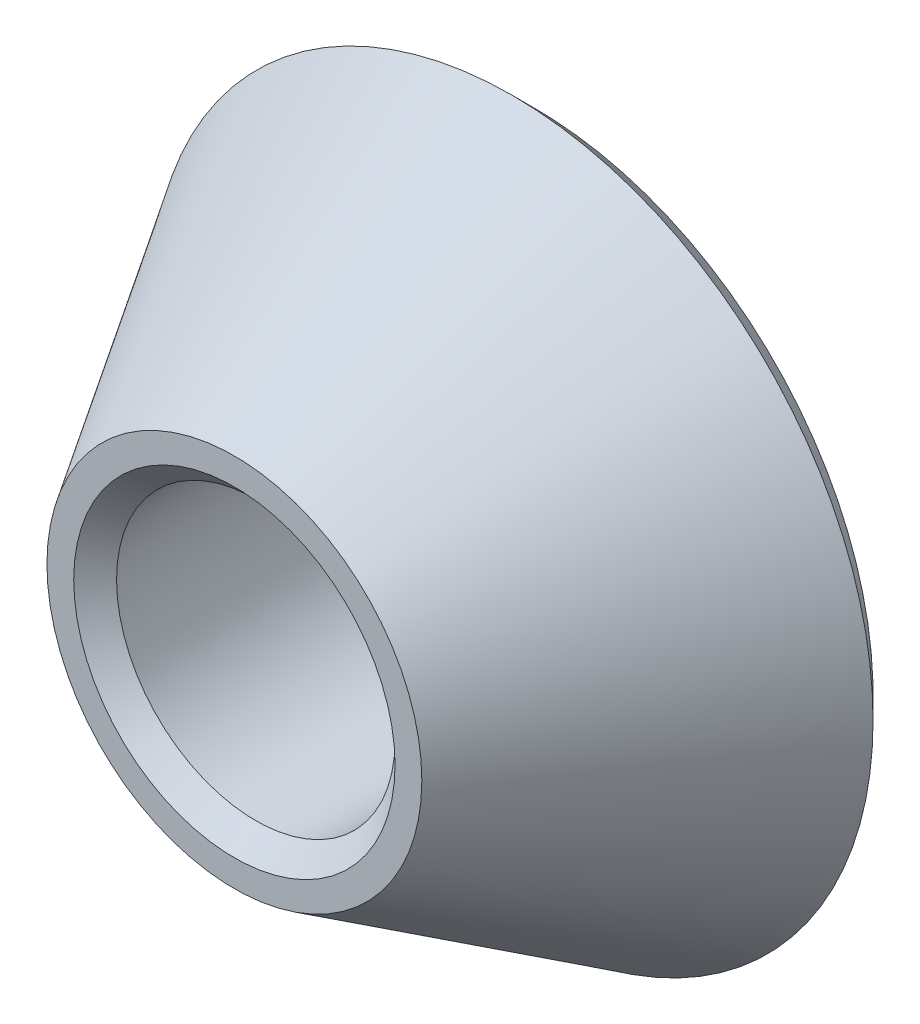
ISO-10303-21;
HEADER;
FILE_DESCRIPTION(('STEP AP214'),'2;1');
FILE_NAME('part.step','',(''),(''),'','','');
FILE_SCHEMA(('AUTOMOTIVE_DESIGN { 1 0 10303 214 1 1 1 1 }'));
ENDSEC;
DATA;
#1=APPLICATION_CONTEXT('core data for automotive mechanical design processes');
#2=APPLICATION_PROTOCOL_DEFINITION('international standard','automotive_design',2000,#1);
#3=PRODUCT_CONTEXT('',#1,'mechanical');
#4=PRODUCT('Part','Part','',(#3));
#5=PRODUCT_RELATED_PRODUCT_CATEGORY('part','',(#4));
#6=PRODUCT_DEFINITION_FORMATION('','',#4);
#7=PRODUCT_DEFINITION_CONTEXT('part definition',#1,'design');
#8=PRODUCT_DEFINITION('design','',#6,#7);
#9=PRODUCT_DEFINITION_SHAPE('','',#8);
#10=(LENGTH_UNIT() NAMED_UNIT(*) SI_UNIT(.MILLI.,.METRE.));
#11=(NAMED_UNIT(*) PLANE_ANGLE_UNIT() SI_UNIT($,.RADIAN.));
#12=(NAMED_UNIT(*) SI_UNIT($,.STERADIAN.) SOLID_ANGLE_UNIT());
#13=UNCERTAINTY_MEASURE_WITH_UNIT(LENGTH_MEASURE(1.E-05),#10,'distance_accuracy_value','');
#14=(GEOMETRIC_REPRESENTATION_CONTEXT(3) GLOBAL_UNCERTAINTY_ASSIGNED_CONTEXT((#13)) GLOBAL_UNIT_ASSIGNED_CONTEXT((#10,
#11,#12)) REPRESENTATION_CONTEXT('',''));
#15=CARTESIAN_POINT('',(0.,0.,0.));
#16=DIRECTION('',(0.,0.,1.));
#17=DIRECTION('',(1.,0.,0.));
#18=AXIS2_PLACEMENT_3D('',#15,#16,#17);
#19=CARTESIAN_POINT('',(0.,6.32554230522413,0.));
#20=DIRECTION('',(0.,0.,-1.));
#21=DIRECTION('',(-1.,0.,0.));
#22=AXIS2_PLACEMENT_3D('',#19,#20,#21);
#23=PLANE('',#22);
#24=CARTESIAN_POINT('',(0.,0.,0.));
#25=DIRECTION('',(0.,0.,-1.));
#26=DIRECTION('',(-1.,0.,0.));
#27=AXIS2_PLACEMENT_3D('',#24,#25,#26);
#28=CIRCLE('',#27,3.00000000000001);
#29=CARTESIAN_POINT('',(-3.00000000000001,0.,0.));
#30=VERTEX_POINT('',#29);
#31=EDGE_CURVE('E10',#30,#30,#28,.F.);
#32=ORIENTED_EDGE('',*,*,#31,.T.);
#33=EDGE_LOOP('',(#32));
#34=FACE_BOUND('',#33,.T.);
#35=CARTESIAN_POINT('',(0.,0.,0.));
#36=DIRECTION('',(0.,0.,-1.));
#37=DIRECTION('',(-1.,0.,0.));
#38=AXIS2_PLACEMENT_3D('',#35,#36,#37);
#39=CIRCLE('',#38,6.32554230522413);
#40=CARTESIAN_POINT('',(-6.32554230522413,0.,0.));
#41=VERTEX_POINT('',#40);
#42=EDGE_CURVE('E61',#41,#41,#39,.T.);
#43=ORIENTED_EDGE('',*,*,#42,.T.);
#44=EDGE_LOOP('',(#43));
#45=FACE_BOUND('',#44,.T.);
#46=ADVANCED_FACE('F34',(#34,#45),#23,.T.);
#47=CARTESIAN_POINT('',(0.,0.,0.));
#48=DIRECTION('',(0.,0.,-1.));
#49=DIRECTION('',(-1.,0.,0.));
#50=AXIS2_PLACEMENT_3D('',#47,#48,#49);
#51=CYLINDRICAL_SURFACE('',#50,2.6);
#52=CARTESIAN_POINT('',(0.,0.,5.2));
#53=DIRECTION('',(0.,0.,1.));
#54=DIRECTION('',(1.,0.,0.));
#55=AXIS2_PLACEMENT_3D('',#52,#53,#54);
#56=CIRCLE('',#55,2.6);
#57=CARTESIAN_POINT('',(2.6,0.,5.2));
#58=VERTEX_POINT('',#57);
#59=EDGE_CURVE('E42',#58,#58,#56,.T.);
#60=ORIENTED_EDGE('',*,*,#59,.T.);
#61=EDGE_LOOP('',(#60));
#62=FACE_BOUND('',#61,.T.);
#63=CARTESIAN_POINT('',(0.,0.,0.400000000000005));
#64=DIRECTION('',(0.,0.,-1.));
#65=DIRECTION('',(-1.,0.,0.));
#66=AXIS2_PLACEMENT_3D('',#63,#64,#65);
#67=CIRCLE('',#66,2.6);
#68=CARTESIAN_POINT('',(-2.6,0.,0.400000000000005));
#69=VERTEX_POINT('',#68);
#70=EDGE_CURVE('E46',#69,#69,#67,.T.);
#71=ORIENTED_EDGE('',*,*,#70,.T.);
#72=EDGE_LOOP('',(#71));
#73=FACE_BOUND('',#72,.T.);
#74=ADVANCED_FACE('F81',(#62,#73),#51,.F.);
#75=CARTESIAN_POINT('',(0.,2.6,5.6));
#76=DIRECTION('',(0.,0.,1.));
#77=DIRECTION('',(1.,0.,0.));
#78=AXIS2_PLACEMENT_3D('',#75,#76,#77);
#79=PLANE('',#78);
#80=CARTESIAN_POINT('',(0.,0.,5.6));
#81=DIRECTION('',(0.,0.,1.));
#82=DIRECTION('',(1.,0.,0.));
#83=AXIS2_PLACEMENT_3D('',#80,#81,#82);
#84=CIRCLE('',#83,3.);
#85=CARTESIAN_POINT('',(3.,0.,5.6));
#86=VERTEX_POINT('',#85);
#87=EDGE_CURVE('E50',#86,#86,#84,.F.);
#88=ORIENTED_EDGE('',*,*,#87,.T.);
#89=EDGE_LOOP('',(#88));
#90=FACE_BOUND('',#89,.T.);
#91=CARTESIAN_POINT('',(0.,0.,5.6));
#92=DIRECTION('',(0.,0.,-1.));
#93=DIRECTION('',(-1.,0.,0.));
#94=AXIS2_PLACEMENT_3D('',#91,#92,#93);
#95=CIRCLE('',#94,3.5);
#96=CARTESIAN_POINT('',(-3.5,0.,5.6));
#97=VERTEX_POINT('',#96);
#98=EDGE_CURVE('E55',#97,#97,#95,.T.);
#99=ORIENTED_EDGE('',*,*,#98,.F.);
#100=EDGE_LOOP('',(#99));
#101=FACE_BOUND('',#100,.T.);
#102=ADVANCED_FACE('F77',(#90,#101),#79,.T.);
#103=CARTESIAN_POINT('',(0.,0.,0.415050889092845));
#104=DIRECTION('',(0.,0.,-1.));
#105=DIRECTION('',(-1.,0.,0.));
#106=AXIS2_PLACEMENT_3D('',#103,#104,#105);
#107=CONICAL_SURFACE('',#106,6.74059319431697,0.558599315343563);
#108=ORIENTED_EDGE('',*,*,#98,.T.);
#109=EDGE_LOOP('',(#108));
#110=FACE_BOUND('',#109,.T.);
#111=CARTESIAN_POINT('',(0.,0.,0.415050889092845));
#112=DIRECTION('',(0.,0.,-1.));
#113=DIRECTION('',(-1.,0.,0.));
#114=AXIS2_PLACEMENT_3D('',#111,#112,#113);
#115=CIRCLE('',#114,6.74059319431697);
#116=CARTESIAN_POINT('',(-6.74059319431697,0.,0.415050889092845));
#117=VERTEX_POINT('',#116);
#118=EDGE_CURVE('E58',#117,#117,#115,.T.);
#119=ORIENTED_EDGE('',*,*,#118,.F.);
#120=EDGE_LOOP('',(#119));
#121=FACE_BOUND('',#120,.T.);
#122=ADVANCED_FACE('F69',(#110,#121),#107,.T.);
#123=CARTESIAN_POINT('',(0.,0.,0.));
#124=DIRECTION('',(0.,0.,1.));
#125=DIRECTION('',(1.,0.,0.));
#126=AXIS2_PLACEMENT_3D('',#123,#124,#125);
#127=CONICAL_SURFACE('',#126,6.32554230522413,0.78539816339745);
#128=ORIENTED_EDGE('',*,*,#118,.T.);
#129=EDGE_LOOP('',(#128));
#130=FACE_BOUND('',#129,.T.);
#131=ORIENTED_EDGE('',*,*,#42,.F.);
#132=EDGE_LOOP('',(#131));
#133=FACE_BOUND('',#132,.T.);
#134=ADVANCED_FACE('F66',(#130,#133),#127,.T.);
#135=CARTESIAN_POINT('',(0.,0.,5.6));
#136=DIRECTION('',(0.,0.,1.));
#137=DIRECTION('',(1.,0.,0.));
#138=AXIS2_PLACEMENT_3D('',#135,#136,#137);
#139=CONICAL_SURFACE('',#138,3.,0.785398163397448);
#140=ORIENTED_EDGE('',*,*,#59,.F.);
#141=EDGE_LOOP('',(#140));
#142=FACE_BOUND('',#141,.T.);
#143=ORIENTED_EDGE('',*,*,#87,.F.);
#144=EDGE_LOOP('',(#143));
#145=FACE_BOUND('',#144,.T.);
#146=ADVANCED_FACE('F68',(#142,#145),#139,.F.);
#147=CARTESIAN_POINT('',(0.,0.,0.400000000000005));
#148=DIRECTION('',(0.,0.,-1.));
#149=DIRECTION('',(-1.,0.,0.));
#150=AXIS2_PLACEMENT_3D('',#147,#148,#149);
#151=CONICAL_SURFACE('',#150,2.6,0.78539816339745);
#152=ORIENTED_EDGE('',*,*,#31,.F.);
#153=EDGE_LOOP('',(#152));
#154=FACE_BOUND('',#153,.T.);
#155=ORIENTED_EDGE('',*,*,#70,.F.);
#156=EDGE_LOOP('',(#155));
#157=FACE_BOUND('',#156,.T.);
#158=ADVANCED_FACE('F37',(#154,#157),#151,.F.);
#159=CLOSED_SHELL('',(#46,#74,#102,#122,#134,#146,#158));
#160=MANIFOLD_SOLID_BREP('B2',#159);
#161=ADVANCED_BREP_SHAPE_REPRESENTATION('',(#18,#160),#14);
#162=SHAPE_DEFINITION_REPRESENTATION(#9,#161);
ENDSEC;
END-ISO-10303-21;
